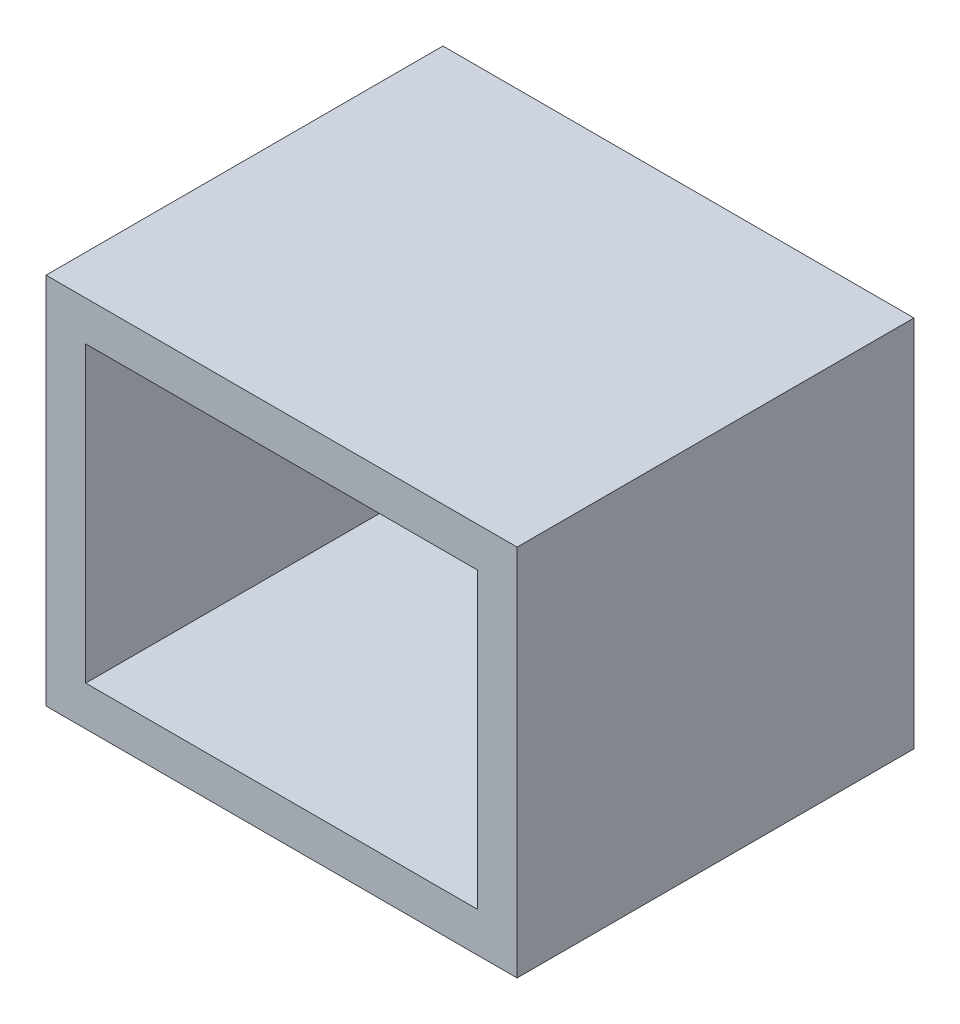
ISO-10303-21;
HEADER;
FILE_DESCRIPTION(('STEP AP214'),'2;1');
FILE_NAME('part.step','',(''),(''),'','','');
FILE_SCHEMA(('AUTOMOTIVE_DESIGN { 1 0 10303 214 1 1 1 1 }'));
ENDSEC;
DATA;
#1=APPLICATION_CONTEXT('core data for automotive mechanical design processes');
#2=APPLICATION_PROTOCOL_DEFINITION('international standard','automotive_design',2000,#1);
#3=PRODUCT_CONTEXT('',#1,'mechanical');
#4=PRODUCT('Part','Part','',(#3));
#5=PRODUCT_RELATED_PRODUCT_CATEGORY('part','',(#4));
#6=PRODUCT_DEFINITION_FORMATION('','',#4);
#7=PRODUCT_DEFINITION_CONTEXT('part definition',#1,'design');
#8=PRODUCT_DEFINITION('design','',#6,#7);
#9=PRODUCT_DEFINITION_SHAPE('','',#8);
#10=(LENGTH_UNIT() NAMED_UNIT(*) SI_UNIT(.MILLI.,.METRE.));
#11=(NAMED_UNIT(*) PLANE_ANGLE_UNIT() SI_UNIT($,.RADIAN.));
#12=(NAMED_UNIT(*) SI_UNIT($,.STERADIAN.) SOLID_ANGLE_UNIT());
#13=UNCERTAINTY_MEASURE_WITH_UNIT(LENGTH_MEASURE(1.E-05),#10,'distance_accuracy_value','');
#14=(GEOMETRIC_REPRESENTATION_CONTEXT(3) GLOBAL_UNCERTAINTY_ASSIGNED_CONTEXT((#13)) GLOBAL_UNIT_ASSIGNED_CONTEXT((#10,
#11,#12)) REPRESENTATION_CONTEXT('',''));
#15=CARTESIAN_POINT('',(0.,0.,0.));
#16=DIRECTION('',(0.,0.,1.));
#17=DIRECTION('',(1.,0.,0.));
#18=AXIS2_PLACEMENT_3D('',#15,#16,#17);
#19=CARTESIAN_POINT('',(0.,23.8822326449134,25.4));
#20=DIRECTION('',(0.,0.,-1.));
#21=DIRECTION('',(-1.,0.,0.));
#22=AXIS2_PLACEMENT_3D('',#19,#20,#21);
#23=PLANE('',#22);
#24=DIRECTION('',(0.,-1.,0.));
#25=VECTOR('',#24,1.);
#26=CARTESIAN_POINT('',(0.,0.,25.4));
#27=LINE('',#26,#25);
#28=CARTESIAN_POINT('',(0.,23.8822326449134,25.4));
#29=VERTEX_POINT('',#28);
#30=CARTESIAN_POINT('',(0.,0.,25.4));
#31=VERTEX_POINT('',#30);
#32=EDGE_CURVE('E133',#29,#31,#27,.T.);
#33=ORIENTED_EDGE('',*,*,#32,.T.);
#34=DIRECTION('',(1.,0.,0.));
#35=VECTOR('',#34,1.);
#36=CARTESIAN_POINT('',(0.,0.,25.4));
#37=LINE('',#36,#35);
#38=CARTESIAN_POINT('',(30.1458101395298,0.,25.4));
#39=VERTEX_POINT('',#38);
#40=EDGE_CURVE('E136',#31,#39,#37,.T.);
#41=ORIENTED_EDGE('',*,*,#40,.T.);
#42=DIRECTION('',(0.,1.,0.));
#43=VECTOR('',#42,1.);
#44=CARTESIAN_POINT('',(30.1458101395298,0.,25.4));
#45=LINE('',#44,#43);
#46=CARTESIAN_POINT('',(30.1458101395298,23.8822326449134,25.4));
#47=VERTEX_POINT('',#46);
#48=EDGE_CURVE('E139',#39,#47,#45,.T.);
#49=ORIENTED_EDGE('',*,*,#48,.T.);
#50=DIRECTION('',(-1.,0.,0.));
#51=VECTOR('',#50,1.);
#52=CARTESIAN_POINT('',(0.,23.8822326449134,25.4));
#53=LINE('',#52,#51);
#54=EDGE_CURVE('E141',#47,#29,#53,.T.);
#55=ORIENTED_EDGE('',*,*,#54,.T.);
#56=EDGE_LOOP('',(#33,#41,#49,#55));
#57=FACE_BOUND('',#56,.T.);
#58=DIRECTION('',(0.,-1.,0.));
#59=VECTOR('',#58,1.);
#60=CARTESIAN_POINT('',(2.54,2.54,25.4));
#61=LINE('',#60,#59);
#62=CARTESIAN_POINT('',(2.54,21.3422326449134,25.4));
#63=VERTEX_POINT('',#62);
#64=CARTESIAN_POINT('',(2.54,2.54,25.4));
#65=VERTEX_POINT('',#64);
#66=EDGE_CURVE('E97',#63,#65,#61,.T.);
#67=ORIENTED_EDGE('',*,*,#66,.F.);
#68=DIRECTION('',(-1.,0.,0.));
#69=VECTOR('',#68,1.);
#70=CARTESIAN_POINT('',(2.54,21.3422326449134,25.4));
#71=LINE('',#70,#69);
#72=CARTESIAN_POINT('',(27.6058101395298,21.3422326449134,25.4));
#73=VERTEX_POINT('',#72);
#74=EDGE_CURVE('E119',#73,#63,#71,.T.);
#75=ORIENTED_EDGE('',*,*,#74,.F.);
#76=DIRECTION('',(0.,1.,0.));
#77=VECTOR('',#76,1.);
#78=CARTESIAN_POINT('',(27.6058101395298,2.54,25.4));
#79=LINE('',#78,#77);
#80=CARTESIAN_POINT('',(27.6058101395298,2.54,25.4));
#81=VERTEX_POINT('',#80);
#82=EDGE_CURVE('E117',#81,#73,#79,.T.);
#83=ORIENTED_EDGE('',*,*,#82,.F.);
#84=DIRECTION('',(1.,0.,0.));
#85=VECTOR('',#84,1.);
#86=CARTESIAN_POINT('',(2.54,2.54,25.4));
#87=LINE('',#86,#85);
#88=EDGE_CURVE('E105',#65,#81,#87,.T.);
#89=ORIENTED_EDGE('',*,*,#88,.F.);
#90=EDGE_LOOP('',(#67,#75,#83,#89));
#91=FACE_BOUND('',#90,.T.);
#92=ADVANCED_FACE('F32',(#57,#91),#23,.F.);
#93=CARTESIAN_POINT('',(0.,23.8822326449134,0.));
#94=DIRECTION('',(0.,0.,-1.));
#95=DIRECTION('',(-1.,0.,0.));
#96=AXIS2_PLACEMENT_3D('',#93,#94,#95);
#97=PLANE('',#96);
#98=DIRECTION('',(0.,-1.,0.));
#99=VECTOR('',#98,1.);
#100=CARTESIAN_POINT('',(0.,0.,0.));
#101=LINE('',#100,#99);
#102=CARTESIAN_POINT('',(0.,23.8822326449134,0.));
#103=VERTEX_POINT('',#102);
#104=CARTESIAN_POINT('',(0.,0.,0.));
#105=VERTEX_POINT('',#104);
#106=EDGE_CURVE('E113',#103,#105,#101,.T.);
#107=ORIENTED_EDGE('',*,*,#106,.F.);
#108=DIRECTION('',(-1.,0.,0.));
#109=VECTOR('',#108,1.);
#110=CARTESIAN_POINT('',(0.,23.8822326449134,0.));
#111=LINE('',#110,#109);
#112=CARTESIAN_POINT('',(30.1458101395298,23.8822326449134,0.));
#113=VERTEX_POINT('',#112);
#114=EDGE_CURVE('E137',#113,#103,#111,.T.);
#115=ORIENTED_EDGE('',*,*,#114,.F.);
#116=DIRECTION('',(0.,1.,0.));
#117=VECTOR('',#116,1.);
#118=CARTESIAN_POINT('',(30.1458101395298,0.,0.));
#119=LINE('',#118,#117);
#120=CARTESIAN_POINT('',(30.1458101395298,0.,0.));
#121=VERTEX_POINT('',#120);
#122=EDGE_CURVE('E148',#121,#113,#119,.T.);
#123=ORIENTED_EDGE('',*,*,#122,.F.);
#124=DIRECTION('',(1.,0.,0.));
#125=VECTOR('',#124,1.);
#126=CARTESIAN_POINT('',(0.,0.,0.));
#127=LINE('',#126,#125);
#128=EDGE_CURVE('E146',#105,#121,#127,.T.);
#129=ORIENTED_EDGE('',*,*,#128,.F.);
#130=EDGE_LOOP('',(#107,#115,#123,#129));
#131=FACE_BOUND('',#130,.T.);
#132=DIRECTION('',(-1.,0.,0.));
#133=VECTOR('',#132,1.);
#134=CARTESIAN_POINT('',(2.54,21.3422326449134,0.));
#135=LINE('',#134,#133);
#136=CARTESIAN_POINT('',(27.6058101395298,21.3422326449134,0.));
#137=VERTEX_POINT('',#136);
#138=CARTESIAN_POINT('',(2.54,21.3422326449134,0.));
#139=VERTEX_POINT('',#138);
#140=EDGE_CURVE('E106',#137,#139,#135,.T.);
#141=ORIENTED_EDGE('',*,*,#140,.T.);
#142=DIRECTION('',(0.,-1.,0.));
#143=VECTOR('',#142,1.);
#144=CARTESIAN_POINT('',(2.54,2.54,0.));
#145=LINE('',#144,#143);
#146=CARTESIAN_POINT('',(2.54,2.54,0.));
#147=VERTEX_POINT('',#146);
#148=EDGE_CURVE('E55',#139,#147,#145,.T.);
#149=ORIENTED_EDGE('',*,*,#148,.T.);
#150=DIRECTION('',(1.,0.,0.));
#151=VECTOR('',#150,1.);
#152=CARTESIAN_POINT('',(2.54,2.54,0.));
#153=LINE('',#152,#151);
#154=CARTESIAN_POINT('',(27.6058101395298,2.54,0.));
#155=VERTEX_POINT('',#154);
#156=EDGE_CURVE('E112',#147,#155,#153,.T.);
#157=ORIENTED_EDGE('',*,*,#156,.T.);
#158=DIRECTION('',(0.,1.,0.));
#159=VECTOR('',#158,1.);
#160=CARTESIAN_POINT('',(27.6058101395298,2.54,0.));
#161=LINE('',#160,#159);
#162=EDGE_CURVE('E125',#155,#137,#161,.T.);
#163=ORIENTED_EDGE('',*,*,#162,.T.);
#164=EDGE_LOOP('',(#141,#149,#157,#163));
#165=FACE_BOUND('',#164,.T.);
#166=ADVANCED_FACE('F166',(#131,#165),#97,.T.);
#167=CARTESIAN_POINT('',(0.,0.,25.4));
#168=DIRECTION('',(1.,0.,0.));
#169=DIRECTION('',(0.,0.,-1.));
#170=AXIS2_PLACEMENT_3D('',#167,#168,#169);
#171=PLANE('',#170);
#172=ORIENTED_EDGE('',*,*,#106,.T.);
#173=DIRECTION('',(0.,0.,-1.));
#174=VECTOR('',#173,1.);
#175=CARTESIAN_POINT('',(0.,0.,25.4));
#176=LINE('',#175,#174);
#177=EDGE_CURVE('E11',#31,#105,#176,.T.);
#178=ORIENTED_EDGE('',*,*,#177,.F.);
#179=ORIENTED_EDGE('',*,*,#32,.F.);
#180=DIRECTION('',(0.,0.,-1.));
#181=VECTOR('',#180,1.);
#182=CARTESIAN_POINT('',(0.,23.8822326449134,25.4));
#183=LINE('',#182,#181);
#184=EDGE_CURVE('E143',#29,#103,#183,.T.);
#185=ORIENTED_EDGE('',*,*,#184,.T.);
#186=EDGE_LOOP('',(#172,#178,#179,#185));
#187=FACE_BOUND('',#186,.T.);
#188=ADVANCED_FACE('F34',(#187),#171,.F.);
#189=CARTESIAN_POINT('',(0.,0.,25.4));
#190=DIRECTION('',(0.,1.,0.));
#191=DIRECTION('',(0.,0.,1.));
#192=AXIS2_PLACEMENT_3D('',#189,#190,#191);
#193=PLANE('',#192);
#194=ORIENTED_EDGE('',*,*,#128,.T.);
#195=DIRECTION('',(0.,0.,-1.));
#196=VECTOR('',#195,1.);
#197=CARTESIAN_POINT('',(30.1458101395298,0.,25.4));
#198=LINE('',#197,#196);
#199=EDGE_CURVE('E40',#39,#121,#198,.T.);
#200=ORIENTED_EDGE('',*,*,#199,.F.);
#201=ORIENTED_EDGE('',*,*,#40,.F.);
#202=ORIENTED_EDGE('',*,*,#177,.T.);
#203=EDGE_LOOP('',(#194,#200,#201,#202));
#204=FACE_BOUND('',#203,.T.);
#205=ADVANCED_FACE('F176',(#204),#193,.F.);
#206=CARTESIAN_POINT('',(30.1458101395298,0.,25.4));
#207=DIRECTION('',(-1.,0.,0.));
#208=DIRECTION('',(0.,0.,1.));
#209=AXIS2_PLACEMENT_3D('',#206,#207,#208);
#210=PLANE('',#209);
#211=ORIENTED_EDGE('',*,*,#122,.T.);
#212=DIRECTION('',(0.,0.,-1.));
#213=VECTOR('',#212,1.);
#214=CARTESIAN_POINT('',(30.1458101395298,23.8822326449134,25.4));
#215=LINE('',#214,#213);
#216=EDGE_CURVE('E153',#47,#113,#215,.T.);
#217=ORIENTED_EDGE('',*,*,#216,.F.);
#218=ORIENTED_EDGE('',*,*,#48,.F.);
#219=ORIENTED_EDGE('',*,*,#199,.T.);
#220=EDGE_LOOP('',(#211,#217,#218,#219));
#221=FACE_BOUND('',#220,.T.);
#222=ADVANCED_FACE('F160',(#221),#210,.F.);
#223=CARTESIAN_POINT('',(0.,23.8822326449134,25.4));
#224=DIRECTION('',(0.,-1.,0.));
#225=DIRECTION('',(0.,0.,-1.));
#226=AXIS2_PLACEMENT_3D('',#223,#224,#225);
#227=PLANE('',#226);
#228=ORIENTED_EDGE('',*,*,#114,.T.);
#229=ORIENTED_EDGE('',*,*,#184,.F.);
#230=ORIENTED_EDGE('',*,*,#54,.F.);
#231=ORIENTED_EDGE('',*,*,#216,.T.);
#232=EDGE_LOOP('',(#228,#229,#230,#231));
#233=FACE_BOUND('',#232,.T.);
#234=ADVANCED_FACE('F170',(#233),#227,.F.);
#235=CARTESIAN_POINT('',(2.54,2.54,25.4));
#236=DIRECTION('',(1.,0.,0.));
#237=DIRECTION('',(0.,0.,-1.));
#238=AXIS2_PLACEMENT_3D('',#235,#236,#237);
#239=PLANE('',#238);
#240=ORIENTED_EDGE('',*,*,#148,.F.);
#241=DIRECTION('',(0.,0.,-1.));
#242=VECTOR('',#241,1.);
#243=CARTESIAN_POINT('',(2.54,21.3422326449134,25.4));
#244=LINE('',#243,#242);
#245=EDGE_CURVE('E101',#63,#139,#244,.T.);
#246=ORIENTED_EDGE('',*,*,#245,.F.);
#247=ORIENTED_EDGE('',*,*,#66,.T.);
#248=DIRECTION('',(0.,0.,-1.));
#249=VECTOR('',#248,1.);
#250=CARTESIAN_POINT('',(2.54,2.54,25.4));
#251=LINE('',#250,#249);
#252=EDGE_CURVE('E100',#65,#147,#251,.T.);
#253=ORIENTED_EDGE('',*,*,#252,.T.);
#254=EDGE_LOOP('',(#240,#246,#247,#253));
#255=FACE_BOUND('',#254,.T.);
#256=ADVANCED_FACE('F99',(#255),#239,.T.);
#257=CARTESIAN_POINT('',(2.54,2.54,25.4));
#258=DIRECTION('',(0.,1.,0.));
#259=DIRECTION('',(0.,0.,1.));
#260=AXIS2_PLACEMENT_3D('',#257,#258,#259);
#261=PLANE('',#260);
#262=ORIENTED_EDGE('',*,*,#156,.F.);
#263=ORIENTED_EDGE('',*,*,#252,.F.);
#264=ORIENTED_EDGE('',*,*,#88,.T.);
#265=DIRECTION('',(0.,0.,-1.));
#266=VECTOR('',#265,1.);
#267=CARTESIAN_POINT('',(27.6058101395298,2.54,25.4));
#268=LINE('',#267,#266);
#269=EDGE_CURVE('E114',#81,#155,#268,.T.);
#270=ORIENTED_EDGE('',*,*,#269,.T.);
#271=EDGE_LOOP('',(#262,#263,#264,#270));
#272=FACE_BOUND('',#271,.T.);
#273=ADVANCED_FACE('F109',(#272),#261,.T.);
#274=CARTESIAN_POINT('',(27.6058101395298,2.54,25.4));
#275=DIRECTION('',(-1.,0.,0.));
#276=DIRECTION('',(0.,0.,1.));
#277=AXIS2_PLACEMENT_3D('',#274,#275,#276);
#278=PLANE('',#277);
#279=ORIENTED_EDGE('',*,*,#162,.F.);
#280=ORIENTED_EDGE('',*,*,#269,.F.);
#281=ORIENTED_EDGE('',*,*,#82,.T.);
#282=DIRECTION('',(0.,0.,-1.));
#283=VECTOR('',#282,1.);
#284=CARTESIAN_POINT('',(27.6058101395298,21.3422326449134,25.4));
#285=LINE('',#284,#283);
#286=EDGE_CURVE('E47',#73,#137,#285,.T.);
#287=ORIENTED_EDGE('',*,*,#286,.T.);
#288=EDGE_LOOP('',(#279,#280,#281,#287));
#289=FACE_BOUND('',#288,.T.);
#290=ADVANCED_FACE('F199',(#289),#278,.T.);
#291=CARTESIAN_POINT('',(2.54,21.3422326449134,25.4));
#292=DIRECTION('',(0.,-1.,0.));
#293=DIRECTION('',(0.,0.,-1.));
#294=AXIS2_PLACEMENT_3D('',#291,#292,#293);
#295=PLANE('',#294);
#296=ORIENTED_EDGE('',*,*,#140,.F.);
#297=ORIENTED_EDGE('',*,*,#286,.F.);
#298=ORIENTED_EDGE('',*,*,#74,.T.);
#299=ORIENTED_EDGE('',*,*,#245,.T.);
#300=EDGE_LOOP('',(#296,#297,#298,#299));
#301=FACE_BOUND('',#300,.T.);
#302=ADVANCED_FACE('F203',(#301),#295,.T.);
#303=CLOSED_SHELL('',(#92,#166,#188,#205,#222,#234,#256,#273,#290,#302));
#304=MANIFOLD_SOLID_BREP('B2',#303);
#305=ADVANCED_BREP_SHAPE_REPRESENTATION('',(#18,#304),#14);
#306=SHAPE_DEFINITION_REPRESENTATION(#9,#305);
ENDSEC;
END-ISO-10303-21;
